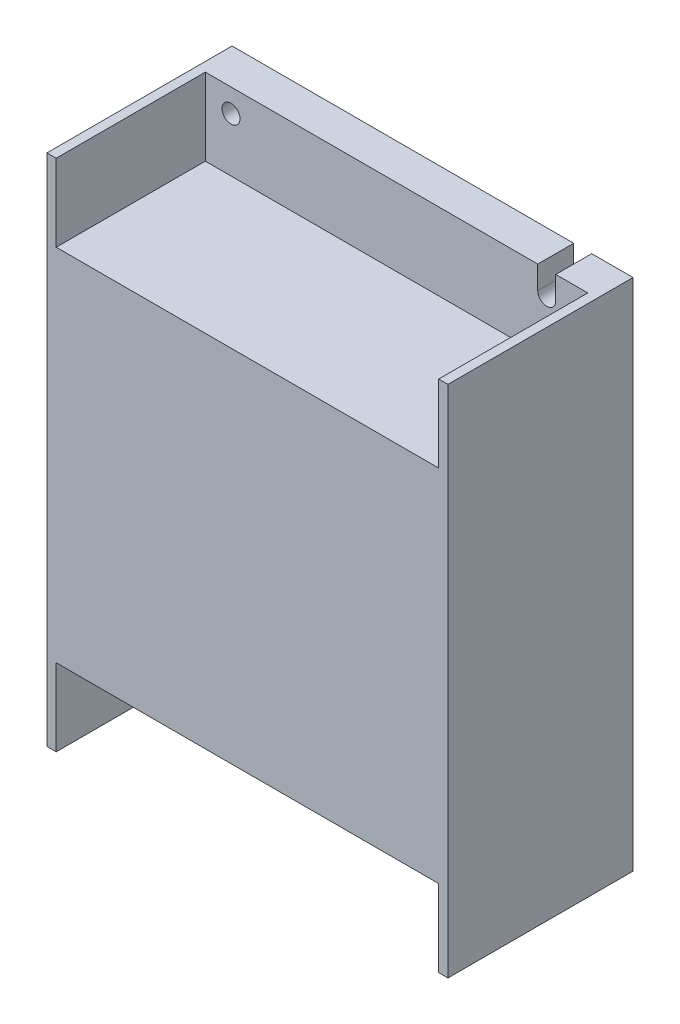
ISO-10303-21;
HEADER;
FILE_DESCRIPTION(('STEP AP214'),'2;1');
FILE_NAME('part.step','',(''),(''),'','','');
FILE_SCHEMA(('AUTOMOTIVE_DESIGN { 1 0 10303 214 1 1 1 1 }'));
ENDSEC;
DATA;
#1=APPLICATION_CONTEXT('core data for automotive mechanical design processes');
#2=APPLICATION_PROTOCOL_DEFINITION('international standard','automotive_design',2000,#1);
#3=PRODUCT_CONTEXT('',#1,'mechanical');
#4=PRODUCT('Part','Part','',(#3));
#5=PRODUCT_RELATED_PRODUCT_CATEGORY('part','',(#4));
#6=PRODUCT_DEFINITION_FORMATION('','',#4);
#7=PRODUCT_DEFINITION_CONTEXT('part definition',#1,'design');
#8=PRODUCT_DEFINITION('design','',#6,#7);
#9=PRODUCT_DEFINITION_SHAPE('','',#8);
#10=(LENGTH_UNIT() NAMED_UNIT(*) SI_UNIT(.MILLI.,.METRE.));
#11=(NAMED_UNIT(*) PLANE_ANGLE_UNIT() SI_UNIT($,.RADIAN.));
#12=(NAMED_UNIT(*) SI_UNIT($,.STERADIAN.) SOLID_ANGLE_UNIT());
#13=UNCERTAINTY_MEASURE_WITH_UNIT(LENGTH_MEASURE(1.E-05),#10,'distance_accuracy_value','');
#14=(GEOMETRIC_REPRESENTATION_CONTEXT(3) GLOBAL_UNCERTAINTY_ASSIGNED_CONTEXT((#13)) GLOBAL_UNIT_ASSIGNED_CONTEXT((#10,
#11,#12)) REPRESENTATION_CONTEXT('',''));
#15=CARTESIAN_POINT('',(0.,0.,0.));
#16=DIRECTION('',(0.,0.,1.));
#17=DIRECTION('',(1.,0.,0.));
#18=AXIS2_PLACEMENT_3D('',#15,#16,#17);
#19=CARTESIAN_POINT('',(-39.,-50.,36.));
#20=DIRECTION('',(0.,1.,0.));
#21=DIRECTION('',(0.,0.,1.));
#22=AXIS2_PLACEMENT_3D('',#19,#20,#21);
#23=PLANE('',#22);
#24=DIRECTION('',(0.,0.,1.));
#25=VECTOR('',#24,1.);
#26=CARTESIAN_POINT('',(-37.2,-50.,-75.8970355152295));
#27=LINE('',#26,#25);
#28=CARTESIAN_POINT('',(-37.2,-50.,7.00000000000001));
#29=VERTEX_POINT('',#28);
#30=CARTESIAN_POINT('',(-37.2,-50.,36.));
#31=VERTEX_POINT('',#30);
#32=EDGE_CURVE('E177',#29,#31,#27,.T.);
#33=ORIENTED_EDGE('',*,*,#32,.T.);
#34=DIRECTION('',(1.,0.,0.));
#35=VECTOR('',#34,1.);
#36=CARTESIAN_POINT('',(-39.,-50.,36.));
#37=LINE('',#36,#35);
#38=CARTESIAN_POINT('',(-39.,-50.,36.));
#39=VERTEX_POINT('',#38);
#40=EDGE_CURVE('E190',#39,#31,#37,.T.);
#41=ORIENTED_EDGE('',*,*,#40,.F.);
#42=DIRECTION('',(0.,0.,-1.));
#43=VECTOR('',#42,1.);
#44=CARTESIAN_POINT('',(-39.,-50.,36.));
#45=LINE('',#44,#43);
#46=CARTESIAN_POINT('',(-39.,-50.,0.));
#47=VERTEX_POINT('',#46);
#48=EDGE_CURVE('E204',#39,#47,#45,.T.);
#49=ORIENTED_EDGE('',*,*,#48,.T.);
#50=DIRECTION('',(1.,0.,0.));
#51=VECTOR('',#50,1.);
#52=CARTESIAN_POINT('',(-39.,-50.,0.));
#53=LINE('',#52,#51);
#54=CARTESIAN_POINT('',(-30.9645076093089,-50.0000000000003,0.));
#55=VERTEX_POINT('',#54);
#56=EDGE_CURVE('E220',#47,#55,#53,.T.);
#57=ORIENTED_EDGE('',*,*,#56,.T.);
#58=DIRECTION('',(0.,0.,-1.));
#59=VECTOR('',#58,1.);
#60=CARTESIAN_POINT('',(-30.9645076093089,-50.0000000000003,10.));
#61=LINE('',#60,#59);
#62=CARTESIAN_POINT('',(-30.9645076093089,-50.,7.00000000000001));
#63=VERTEX_POINT('',#62);
#64=EDGE_CURVE('E325',#63,#55,#61,.T.);
#65=ORIENTED_EDGE('',*,*,#64,.F.);
#66=DIRECTION('',(1.,0.,0.));
#67=VECTOR('',#66,1.);
#68=CARTESIAN_POINT('',(-37.2,-50.,7.00000000000001));
#69=LINE('',#68,#67);
#70=EDGE_CURVE('E192',#29,#63,#69,.T.);
#71=ORIENTED_EDGE('',*,*,#70,.F.);
#72=EDGE_LOOP('',(#33,#41,#49,#57,#65,#71));
#73=FACE_BOUND('',#72,.T.);
#74=ADVANCED_FACE('F37',(#73),#23,.F.);
#75=DIRECTION('',(0.,0.,1.));
#76=VECTOR('',#75,1.);
#77=CARTESIAN_POINT('',(37.2,-50.,-75.8970355152295));
#78=LINE('',#77,#76);
#79=CARTESIAN_POINT('',(37.2,-50.,7.00000000000001));
#80=VERTEX_POINT('',#79);
#81=CARTESIAN_POINT('',(37.2,-50.,36.));
#82=VERTEX_POINT('',#81);
#83=EDGE_CURVE('E193',#80,#82,#78,.T.);
#84=ORIENTED_EDGE('',*,*,#83,.F.);
#85=CARTESIAN_POINT('',(-27.4645076093089,-50.,7.00000000000001));
#86=VERTEX_POINT('',#85);
#87=EDGE_CURVE('E490',#86,#80,#69,.T.);
#88=ORIENTED_EDGE('',*,*,#87,.F.);
#89=DIRECTION('',(0.,0.,-1.));
#90=VECTOR('',#89,1.);
#91=CARTESIAN_POINT('',(-27.4645076093089,-50.0000000000003,10.));
#92=LINE('',#91,#90);
#93=CARTESIAN_POINT('',(-27.4645076093089,-50.0000000000003,0.));
#94=VERTEX_POINT('',#93);
#95=EDGE_CURVE('E317',#86,#94,#92,.T.);
#96=ORIENTED_EDGE('',*,*,#95,.T.);
#97=CARTESIAN_POINT('',(39.,-50.,0.));
#98=VERTEX_POINT('',#97);
#99=EDGE_CURVE('E219',#94,#98,#53,.T.);
#100=ORIENTED_EDGE('',*,*,#99,.T.);
#101=DIRECTION('',(0.,0.,-1.));
#102=VECTOR('',#101,1.);
#103=CARTESIAN_POINT('',(39.,-50.,36.));
#104=LINE('',#103,#102);
#105=CARTESIAN_POINT('',(39.,-50.,36.));
#106=VERTEX_POINT('',#105);
#107=EDGE_CURVE('E200',#106,#98,#104,.T.);
#108=ORIENTED_EDGE('',*,*,#107,.F.);
#109=EDGE_CURVE('E201',#82,#106,#37,.T.);
#110=ORIENTED_EDGE('',*,*,#109,.F.);
#111=EDGE_LOOP('',(#84,#88,#96,#100,#108,#110));
#112=FACE_BOUND('',#111,.T.);
#113=ADVANCED_FACE('F361',(#112),#23,.F.);
#114=CARTESIAN_POINT('',(0.,0.,36.));
#115=DIRECTION('',(0.,0.,1.));
#116=DIRECTION('',(1.,0.,0.));
#117=AXIS2_PLACEMENT_3D('',#114,#115,#116);
#118=PLANE('',#117);
#119=DIRECTION('',(1.,0.,0.));
#120=VECTOR('',#119,1.);
#121=CARTESIAN_POINT('',(-37.2,-35.,36.));
#122=LINE('',#121,#120);
#123=CARTESIAN_POINT('',(-37.2,-35.,36.));
#124=VERTEX_POINT('',#123);
#125=CARTESIAN_POINT('',(37.2,-35.,36.));
#126=VERTEX_POINT('',#125);
#127=EDGE_CURVE('E194',#124,#126,#122,.T.);
#128=ORIENTED_EDGE('',*,*,#127,.T.);
#129=DIRECTION('',(0.,-1.,0.));
#130=VECTOR('',#129,1.);
#131=CARTESIAN_POINT('',(37.2,-50.,36.));
#132=LINE('',#131,#130);
#133=EDGE_CURVE('E185',#126,#82,#132,.T.);
#134=ORIENTED_EDGE('',*,*,#133,.T.);
#135=ORIENTED_EDGE('',*,*,#109,.T.);
#136=DIRECTION('',(0.,1.,0.));
#137=VECTOR('',#136,1.);
#138=CARTESIAN_POINT('',(39.,50.,36.));
#139=LINE('',#138,#137);
#140=CARTESIAN_POINT('',(39.,50.,36.));
#141=VERTEX_POINT('',#140);
#142=EDGE_CURVE('E222',#106,#141,#139,.T.);
#143=ORIENTED_EDGE('',*,*,#142,.T.);
#144=DIRECTION('',(-1.,0.,0.));
#145=VECTOR('',#144,1.);
#146=CARTESIAN_POINT('',(-39.,50.,36.));
#147=LINE('',#146,#145);
#148=CARTESIAN_POINT('',(37.2,50.,36.));
#149=VERTEX_POINT('',#148);
#150=EDGE_CURVE('E289',#141,#149,#147,.T.);
#151=ORIENTED_EDGE('',*,*,#150,.T.);
#152=DIRECTION('',(0.,1.,0.));
#153=VECTOR('',#152,1.);
#154=CARTESIAN_POINT('',(37.2,50.,36.));
#155=LINE('',#154,#153);
#156=CARTESIAN_POINT('',(37.2,35.,36.));
#157=VERTEX_POINT('',#156);
#158=EDGE_CURVE('E276',#157,#149,#155,.T.);
#159=ORIENTED_EDGE('',*,*,#158,.F.);
#160=DIRECTION('',(1.,0.,0.));
#161=VECTOR('',#160,1.);
#162=CARTESIAN_POINT('',(-37.2,35.,36.));
#163=LINE('',#162,#161);
#164=CARTESIAN_POINT('',(-37.2,35.,36.));
#165=VERTEX_POINT('',#164);
#166=EDGE_CURVE('E273',#165,#157,#163,.T.);
#167=ORIENTED_EDGE('',*,*,#166,.F.);
#168=DIRECTION('',(0.,-1.,0.));
#169=VECTOR('',#168,1.);
#170=CARTESIAN_POINT('',(-37.2,50.,36.));
#171=LINE('',#170,#169);
#172=CARTESIAN_POINT('',(-37.2,50.,36.));
#173=VERTEX_POINT('',#172);
#174=EDGE_CURVE('E235',#173,#165,#171,.T.);
#175=ORIENTED_EDGE('',*,*,#174,.F.);
#176=CARTESIAN_POINT('',(-39.,50.,36.));
#177=VERTEX_POINT('',#176);
#178=EDGE_CURVE('E288',#173,#177,#147,.T.);
#179=ORIENTED_EDGE('',*,*,#178,.T.);
#180=DIRECTION('',(0.,-1.,0.));
#181=VECTOR('',#180,1.);
#182=CARTESIAN_POINT('',(-39.,50.,36.));
#183=LINE('',#182,#181);
#184=EDGE_CURVE('E198',#177,#39,#183,.T.);
#185=ORIENTED_EDGE('',*,*,#184,.T.);
#186=ORIENTED_EDGE('',*,*,#40,.T.);
#187=DIRECTION('',(0.,1.,0.));
#188=VECTOR('',#187,1.);
#189=CARTESIAN_POINT('',(-37.2,-50.,36.));
#190=LINE('',#189,#188);
#191=EDGE_CURVE('E174',#31,#124,#190,.T.);
#192=ORIENTED_EDGE('',*,*,#191,.T.);
#193=EDGE_LOOP('',(#128,#134,#135,#143,#151,#159,#167,#175,#179,#185,#186,#192));
#194=FACE_BOUND('',#193,.T.);
#195=ADVANCED_FACE('F196',(#194),#118,.T.);
#196=CARTESIAN_POINT('',(32.1994347289344,-45.4999999999997,10.));
#197=DIRECTION('',(0.,0.,-1.));
#198=DIRECTION('',(-1.,0.,0.));
#199=AXIS2_PLACEMENT_3D('',#196,#197,#198);
#200=CYLINDRICAL_SURFACE('',#199,1.75);
#201=CARTESIAN_POINT('',(32.1994347289344,-45.4999999999997,0.));
#202=DIRECTION('',(0.,0.,-1.));
#203=DIRECTION('',(-1.,0.,0.));
#204=AXIS2_PLACEMENT_3D('',#201,#202,#203);
#205=CIRCLE('',#204,1.75);
#206=CARTESIAN_POINT('',(30.4494347289344,-45.4999999999997,0.));
#207=VERTEX_POINT('',#206);
#208=EDGE_CURVE('E324',#207,#207,#205,.T.);
#209=ORIENTED_EDGE('',*,*,#208,.T.);
#210=EDGE_LOOP('',(#209));
#211=FACE_BOUND('',#210,.T.);
#212=CARTESIAN_POINT('',(32.1994347289344,-45.4999999999997,7.));
#213=DIRECTION('',(0.,0.,1.));
#214=DIRECTION('',(1.,0.,0.));
#215=AXIS2_PLACEMENT_3D('',#212,#213,#214);
#216=CIRCLE('',#215,1.75);
#217=CARTESIAN_POINT('',(33.9494347289344,-45.4999999999997,7.));
#218=VERTEX_POINT('',#217);
#219=EDGE_CURVE('E499',#218,#218,#216,.F.);
#220=ORIENTED_EDGE('',*,*,#219,.F.);
#221=EDGE_LOOP('',(#220));
#222=FACE_BOUND('',#221,.T.);
#223=ADVANCED_FACE('F387',(#211,#222),#200,.F.);
#224=CARTESIAN_POINT('',(-29.2145076093089,-45.5000000000003,10.));
#225=DIRECTION('',(0.,0.,-1.));
#226=DIRECTION('',(-1.,0.,0.));
#227=AXIS2_PLACEMENT_3D('',#224,#225,#226);
#228=CYLINDRICAL_SURFACE('',#227,1.75);
#229=CARTESIAN_POINT('',(-29.2145076093089,-45.5000000000003,7.));
#230=DIRECTION('',(0.,0.,1.));
#231=DIRECTION('',(1.,0.,0.));
#232=AXIS2_PLACEMENT_3D('',#229,#230,#231);
#233=CIRCLE('',#232,1.75);
#234=CARTESIAN_POINT('',(-30.9645076093089,-45.5000000000003,7.));
#235=VERTEX_POINT('',#234);
#236=CARTESIAN_POINT('',(-27.4645076093089,-45.5000000000003,7.));
#237=VERTEX_POINT('',#236);
#238=EDGE_CURVE('E51',#235,#237,#233,.F.);
#239=ORIENTED_EDGE('',*,*,#238,.F.);
#240=DIRECTION('',(0.,0.,-1.));
#241=VECTOR('',#240,1.);
#242=CARTESIAN_POINT('',(-30.9645076093089,-45.5000000000003,10.));
#243=LINE('',#242,#241);
#244=CARTESIAN_POINT('',(-30.9645076093089,-45.5000000000003,0.));
#245=VERTEX_POINT('',#244);
#246=EDGE_CURVE('E322',#235,#245,#243,.T.);
#247=ORIENTED_EDGE('',*,*,#246,.T.);
#248=CARTESIAN_POINT('',(-29.2145076093089,-45.5000000000003,0.));
#249=DIRECTION('',(0.,0.,-1.));
#250=DIRECTION('',(1.,0.,0.));
#251=AXIS2_PLACEMENT_3D('',#248,#249,#250);
#252=CIRCLE('',#251,1.75);
#253=CARTESIAN_POINT('',(-27.4645076093089,-45.5000000000003,0.));
#254=VERTEX_POINT('',#253);
#255=EDGE_CURVE('E312',#245,#254,#252,.T.);
#256=ORIENTED_EDGE('',*,*,#255,.T.);
#257=DIRECTION('',(0.,0.,-1.));
#258=VECTOR('',#257,1.);
#259=CARTESIAN_POINT('',(-27.4645076093089,-45.5000000000003,10.));
#260=LINE('',#259,#258);
#261=EDGE_CURVE('E58',#237,#254,#260,.T.);
#262=ORIENTED_EDGE('',*,*,#261,.F.);
#263=EDGE_LOOP('',(#239,#247,#256,#262));
#264=FACE_BOUND('',#263,.T.);
#265=ADVANCED_FACE('F381',(#264),#228,.F.);
#266=CARTESIAN_POINT('',(-30.9645076093089,-50.0000000000003,10.));
#267=DIRECTION('',(-1.,0.,0.));
#268=DIRECTION('',(0.,0.,1.));
#269=AXIS2_PLACEMENT_3D('',#266,#267,#268);
#270=PLANE('',#269);
#271=DIRECTION('',(0.,1.,0.));
#272=VECTOR('',#271,1.);
#273=CARTESIAN_POINT('',(-30.9645076093089,-50.0000000000003,7.));
#274=LINE('',#273,#272);
#275=EDGE_CURVE('E496',#63,#235,#274,.T.);
#276=ORIENTED_EDGE('',*,*,#275,.F.);
#277=ORIENTED_EDGE('',*,*,#64,.T.);
#278=DIRECTION('',(0.,1.,0.));
#279=VECTOR('',#278,1.);
#280=CARTESIAN_POINT('',(-30.9645076093089,-50.0000000000003,0.));
#281=LINE('',#280,#279);
#282=EDGE_CURVE('E310',#55,#245,#281,.T.);
#283=ORIENTED_EDGE('',*,*,#282,.T.);
#284=ORIENTED_EDGE('',*,*,#246,.F.);
#285=EDGE_LOOP('',(#276,#277,#283,#284));
#286=FACE_BOUND('',#285,.T.);
#287=ADVANCED_FACE('F376',(#286),#270,.F.);
#288=CARTESIAN_POINT('',(-27.4645076093089,-45.5000000000003,10.));
#289=DIRECTION('',(1.,0.,0.));
#290=DIRECTION('',(0.,0.,-1.));
#291=AXIS2_PLACEMENT_3D('',#288,#289,#290);
#292=PLANE('',#291);
#293=DIRECTION('',(0.,-1.,0.));
#294=VECTOR('',#293,1.);
#295=CARTESIAN_POINT('',(-27.4645076093089,-45.5000000000003,7.));
#296=LINE('',#295,#294);
#297=EDGE_CURVE('E12',#237,#86,#296,.T.);
#298=ORIENTED_EDGE('',*,*,#297,.F.);
#299=ORIENTED_EDGE('',*,*,#261,.T.);
#300=DIRECTION('',(0.,-1.,0.));
#301=VECTOR('',#300,1.);
#302=CARTESIAN_POINT('',(-27.4645076093089,-45.5000000000003,0.));
#303=LINE('',#302,#301);
#304=EDGE_CURVE('E315',#254,#94,#303,.T.);
#305=ORIENTED_EDGE('',*,*,#304,.T.);
#306=ORIENTED_EDGE('',*,*,#95,.F.);
#307=EDGE_LOOP('',(#298,#299,#305,#306));
#308=FACE_BOUND('',#307,.T.);
#309=ADVANCED_FACE('F372',(#308),#292,.F.);
#310=CARTESIAN_POINT('',(-39.,50.,36.));
#311=DIRECTION('',(0.,-1.,0.));
#312=DIRECTION('',(0.,0.,-1.));
#313=AXIS2_PLACEMENT_3D('',#310,#311,#312);
#314=PLANE('',#313);
#315=DIRECTION('',(-1.,0.,0.));
#316=VECTOR('',#315,1.);
#317=CARTESIAN_POINT('',(-39.,50.,0.));
#318=LINE('',#317,#316);
#319=CARTESIAN_POINT('',(39.,50.,0.));
#320=VERTEX_POINT('',#319);
#321=CARTESIAN_POINT('',(30.9645076093089,50.,0.));
#322=VERTEX_POINT('',#321);
#323=EDGE_CURVE('E214',#320,#322,#318,.T.);
#324=ORIENTED_EDGE('',*,*,#323,.T.);
#325=DIRECTION('',(0.,0.,-1.));
#326=VECTOR('',#325,1.);
#327=CARTESIAN_POINT('',(30.9645076093089,50.,10.));
#328=LINE('',#327,#326);
#329=CARTESIAN_POINT('',(30.9645076093089,50.,7.));
#330=VERTEX_POINT('',#329);
#331=EDGE_CURVE('E245',#330,#322,#328,.T.);
#332=ORIENTED_EDGE('',*,*,#331,.F.);
#333=DIRECTION('',(1.,0.,0.));
#334=VECTOR('',#333,1.);
#335=CARTESIAN_POINT('',(-37.2,50.,7.00000000000001));
#336=LINE('',#335,#334);
#337=CARTESIAN_POINT('',(37.2,50.,7.00000000000001));
#338=VERTEX_POINT('',#337);
#339=EDGE_CURVE('E254',#330,#338,#336,.T.);
#340=ORIENTED_EDGE('',*,*,#339,.T.);
#341=DIRECTION('',(0.,0.,1.));
#342=VECTOR('',#341,1.);
#343=CARTESIAN_POINT('',(37.2,50.,-75.8970355152295));
#344=LINE('',#343,#342);
#345=EDGE_CURVE('E280',#338,#149,#344,.T.);
#346=ORIENTED_EDGE('',*,*,#345,.T.);
#347=ORIENTED_EDGE('',*,*,#150,.F.);
#348=DIRECTION('',(0.,0.,-1.));
#349=VECTOR('',#348,1.);
#350=CARTESIAN_POINT('',(39.,50.,36.));
#351=LINE('',#350,#349);
#352=EDGE_CURVE('E228',#141,#320,#351,.T.);
#353=ORIENTED_EDGE('',*,*,#352,.T.);
#354=EDGE_LOOP('',(#324,#332,#340,#346,#347,#353));
#355=FACE_BOUND('',#354,.T.);
#356=ADVANCED_FACE('F252',(#355),#314,.F.);
#357=CARTESIAN_POINT('',(39.,50.,36.));
#358=DIRECTION('',(-1.,0.,0.));
#359=DIRECTION('',(0.,-1.,0.));
#360=AXIS2_PLACEMENT_3D('',#357,#358,#359);
#361=PLANE('',#360);
#362=DIRECTION('',(0.,1.,0.));
#363=VECTOR('',#362,1.);
#364=CARTESIAN_POINT('',(39.,50.,0.));
#365=LINE('',#364,#363);
#366=EDGE_CURVE('E209',#98,#320,#365,.T.);
#367=ORIENTED_EDGE('',*,*,#366,.T.);
#368=ORIENTED_EDGE('',*,*,#352,.F.);
#369=ORIENTED_EDGE('',*,*,#142,.F.);
#370=ORIENTED_EDGE('',*,*,#107,.T.);
#371=EDGE_LOOP('',(#367,#368,#369,#370));
#372=FACE_BOUND('',#371,.T.);
#373=ADVANCED_FACE('F39',(#372),#361,.F.);
#374=CARTESIAN_POINT('',(-37.2,50.,7.00000000000001));
#375=VERTEX_POINT('',#374);
#376=CARTESIAN_POINT('',(27.4645076093089,50.,7.00000000000001));
#377=VERTEX_POINT('',#376);
#378=EDGE_CURVE('E263',#375,#377,#336,.T.);
#379=ORIENTED_EDGE('',*,*,#378,.T.);
#380=DIRECTION('',(0.,0.,-1.));
#381=VECTOR('',#380,1.);
#382=CARTESIAN_POINT('',(27.4645076093089,50.,10.));
#383=LINE('',#382,#381);
#384=CARTESIAN_POINT('',(27.4645076093089,50.,0.));
#385=VERTEX_POINT('',#384);
#386=EDGE_CURVE('E256',#377,#385,#383,.T.);
#387=ORIENTED_EDGE('',*,*,#386,.T.);
#388=CARTESIAN_POINT('',(-39.,50.,0.));
#389=VERTEX_POINT('',#388);
#390=EDGE_CURVE('E212',#385,#389,#318,.T.);
#391=ORIENTED_EDGE('',*,*,#390,.T.);
#392=DIRECTION('',(0.,0.,-1.));
#393=VECTOR('',#392,1.);
#394=CARTESIAN_POINT('',(-39.,50.,36.));
#395=LINE('',#394,#393);
#396=EDGE_CURVE('E225',#177,#389,#395,.T.);
#397=ORIENTED_EDGE('',*,*,#396,.F.);
#398=ORIENTED_EDGE('',*,*,#178,.F.);
#399=DIRECTION('',(0.,0.,1.));
#400=VECTOR('',#399,1.);
#401=CARTESIAN_POINT('',(-37.2,50.,-75.8970355152295));
#402=LINE('',#401,#400);
#403=EDGE_CURVE('E267',#375,#173,#402,.T.);
#404=ORIENTED_EDGE('',*,*,#403,.F.);
#405=EDGE_LOOP('',(#379,#387,#391,#397,#398,#404));
#406=FACE_BOUND('',#405,.T.);
#407=ADVANCED_FACE('F298',(#406),#314,.F.);
#408=CARTESIAN_POINT('',(-39.,50.,36.));
#409=DIRECTION('',(1.,0.,0.));
#410=DIRECTION('',(0.,1.,0.));
#411=AXIS2_PLACEMENT_3D('',#408,#409,#410);
#412=PLANE('',#411);
#413=DIRECTION('',(0.,-1.,0.));
#414=VECTOR('',#413,1.);
#415=CARTESIAN_POINT('',(-39.,50.,0.));
#416=LINE('',#415,#414);
#417=EDGE_CURVE('E217',#389,#47,#416,.T.);
#418=ORIENTED_EDGE('',*,*,#417,.T.);
#419=ORIENTED_EDGE('',*,*,#48,.F.);
#420=ORIENTED_EDGE('',*,*,#184,.F.);
#421=ORIENTED_EDGE('',*,*,#396,.T.);
#422=EDGE_LOOP('',(#418,#419,#420,#421));
#423=FACE_BOUND('',#422,.T.);
#424=ADVANCED_FACE('F303',(#423),#412,.F.);
#425=CARTESIAN_POINT('',(0.,0.,0.));
#426=DIRECTION('',(0.,0.,1.));
#427=DIRECTION('',(1.,0.,0.));
#428=AXIS2_PLACEMENT_3D('',#425,#426,#427);
#429=PLANE('',#428);
#430=ORIENTED_EDGE('',*,*,#208,.F.);
#431=EDGE_LOOP('',(#430));
#432=FACE_BOUND('',#431,.T.);
#433=CARTESIAN_POINT('',(-32.199434728934,45.5,0.));
#434=DIRECTION('',(0.,0.,-1.));
#435=DIRECTION('',(-1.,0.,0.));
#436=AXIS2_PLACEMENT_3D('',#433,#434,#435);
#437=CIRCLE('',#436,1.75);
#438=CARTESIAN_POINT('',(-33.949434728934,45.5,0.));
#439=VERTEX_POINT('',#438);
#440=EDGE_CURVE('E236',#439,#439,#437,.T.);
#441=ORIENTED_EDGE('',*,*,#440,.F.);
#442=EDGE_LOOP('',(#441));
#443=FACE_BOUND('',#442,.T.);
#444=ORIENTED_EDGE('',*,*,#255,.F.);
#445=ORIENTED_EDGE('',*,*,#282,.F.);
#446=ORIENTED_EDGE('',*,*,#56,.F.);
#447=ORIENTED_EDGE('',*,*,#417,.F.);
#448=ORIENTED_EDGE('',*,*,#390,.F.);
#449=DIRECTION('',(0.,1.,0.));
#450=VECTOR('',#449,1.);
#451=CARTESIAN_POINT('',(27.4645076093089,45.5,0.));
#452=LINE('',#451,#450);
#453=CARTESIAN_POINT('',(27.4645076093089,45.5,0.));
#454=VERTEX_POINT('',#453);
#455=EDGE_CURVE('E333',#454,#385,#452,.T.);
#456=ORIENTED_EDGE('',*,*,#455,.F.);
#457=CARTESIAN_POINT('',(29.2145076093089,45.5,0.));
#458=DIRECTION('',(0.,0.,-1.));
#459=DIRECTION('',(1.,0.,0.));
#460=AXIS2_PLACEMENT_3D('',#457,#458,#459);
#461=CIRCLE('',#460,1.75);
#462=CARTESIAN_POINT('',(30.9645076093089,45.5,0.));
#463=VERTEX_POINT('',#462);
#464=EDGE_CURVE('E330',#463,#454,#461,.T.);
#465=ORIENTED_EDGE('',*,*,#464,.F.);
#466=DIRECTION('',(0.,-1.,0.));
#467=VECTOR('',#466,1.);
#468=CARTESIAN_POINT('',(30.9645076093089,50.,0.));
#469=LINE('',#468,#467);
#470=EDGE_CURVE('E335',#322,#463,#469,.T.);
#471=ORIENTED_EDGE('',*,*,#470,.F.);
#472=ORIENTED_EDGE('',*,*,#323,.F.);
#473=ORIENTED_EDGE('',*,*,#366,.F.);
#474=ORIENTED_EDGE('',*,*,#99,.F.);
#475=ORIENTED_EDGE('',*,*,#304,.F.);
#476=EDGE_LOOP('',(#444,#445,#446,#447,#448,#456,#465,#471,#472,#473,#474,#475));
#477=FACE_BOUND('',#476,.T.);
#478=ADVANCED_FACE('F308',(#432,#443,#477),#429,.F.);
#479=CARTESIAN_POINT('',(-37.2,50.,-75.8970355152295));
#480=DIRECTION('',(-1.,0.,0.));
#481=DIRECTION('',(0.,-1.,0.));
#482=AXIS2_PLACEMENT_3D('',#479,#480,#481);
#483=PLANE('',#482);
#484=DIRECTION('',(0.,1.,0.));
#485=VECTOR('',#484,1.);
#486=CARTESIAN_POINT('',(-37.2,50.,7.00000000000001));
#487=LINE('',#486,#485);
#488=CARTESIAN_POINT('',(-37.2,35.,7.00000000000001));
#489=VERTEX_POINT('',#488);
#490=EDGE_CURVE('E266',#489,#375,#487,.T.);
#491=ORIENTED_EDGE('',*,*,#490,.T.);
#492=ORIENTED_EDGE('',*,*,#403,.T.);
#493=ORIENTED_EDGE('',*,*,#174,.T.);
#494=DIRECTION('',(0.,0.,1.));
#495=VECTOR('',#494,1.);
#496=CARTESIAN_POINT('',(-37.2,35.,-75.8970355152295));
#497=LINE('',#496,#495);
#498=EDGE_CURVE('E278',#489,#165,#497,.T.);
#499=ORIENTED_EDGE('',*,*,#498,.F.);
#500=EDGE_LOOP('',(#491,#492,#493,#499));
#501=FACE_BOUND('',#500,.T.);
#502=ADVANCED_FACE('F346',(#501),#483,.F.);
#503=CARTESIAN_POINT('',(37.2,50.,-75.8970355152295));
#504=DIRECTION('',(1.,0.,0.));
#505=DIRECTION('',(0.,1.,0.));
#506=AXIS2_PLACEMENT_3D('',#503,#504,#505);
#507=PLANE('',#506);
#508=DIRECTION('',(0.,-1.,0.));
#509=VECTOR('',#508,1.);
#510=CARTESIAN_POINT('',(37.2,50.,7.00000000000001));
#511=LINE('',#510,#509);
#512=CARTESIAN_POINT('',(37.2,35.,7.00000000000001));
#513=VERTEX_POINT('',#512);
#514=EDGE_CURVE('E261',#338,#513,#511,.T.);
#515=ORIENTED_EDGE('',*,*,#514,.T.);
#516=DIRECTION('',(0.,0.,1.));
#517=VECTOR('',#516,1.);
#518=CARTESIAN_POINT('',(37.2,35.,-75.8970355152295));
#519=LINE('',#518,#517);
#520=EDGE_CURVE('E282',#513,#157,#519,.T.);
#521=ORIENTED_EDGE('',*,*,#520,.T.);
#522=ORIENTED_EDGE('',*,*,#158,.T.);
#523=ORIENTED_EDGE('',*,*,#345,.F.);
#524=EDGE_LOOP('',(#515,#521,#522,#523));
#525=FACE_BOUND('',#524,.T.);
#526=ADVANCED_FACE('F353',(#525),#507,.F.);
#527=CARTESIAN_POINT('',(-37.2,35.,-75.8970355152295));
#528=DIRECTION('',(0.,-1.,0.));
#529=DIRECTION('',(0.,0.,-1.));
#530=AXIS2_PLACEMENT_3D('',#527,#528,#529);
#531=PLANE('',#530);
#532=DIRECTION('',(-1.,0.,0.));
#533=VECTOR('',#532,1.);
#534=CARTESIAN_POINT('',(-37.2,35.,7.00000000000001));
#535=LINE('',#534,#533);
#536=EDGE_CURVE('E213',#513,#489,#535,.T.);
#537=ORIENTED_EDGE('',*,*,#536,.T.);
#538=ORIENTED_EDGE('',*,*,#498,.T.);
#539=ORIENTED_EDGE('',*,*,#166,.T.);
#540=ORIENTED_EDGE('',*,*,#520,.F.);
#541=EDGE_LOOP('',(#537,#538,#539,#540));
#542=FACE_BOUND('',#541,.T.);
#543=ADVANCED_FACE('F408',(#542),#531,.F.);
#544=CARTESIAN_POINT('',(0.,0.,7.));
#545=DIRECTION('',(0.,0.,1.));
#546=DIRECTION('',(1.,0.,0.));
#547=AXIS2_PLACEMENT_3D('',#544,#545,#546);
#548=PLANE('',#547);
#549=DIRECTION('',(0.,1.,0.));
#550=VECTOR('',#549,1.);
#551=CARTESIAN_POINT('',(30.9645076093089,0.,7.));
#552=LINE('',#551,#550);
#553=CARTESIAN_POINT('',(30.9645076093089,45.5,7.));
#554=VERTEX_POINT('',#553);
#555=EDGE_CURVE('E45',#554,#330,#552,.T.);
#556=ORIENTED_EDGE('',*,*,#555,.F.);
#557=CARTESIAN_POINT('',(29.2145076093089,45.5,7.));
#558=DIRECTION('',(0.,0.,1.));
#559=DIRECTION('',(1.,0.,0.));
#560=AXIS2_PLACEMENT_3D('',#557,#558,#559);
#561=CIRCLE('',#560,1.75);
#562=CARTESIAN_POINT('',(27.4645076093089,45.5,7.));
#563=VERTEX_POINT('',#562);
#564=EDGE_CURVE('E238',#563,#554,#561,.T.);
#565=ORIENTED_EDGE('',*,*,#564,.F.);
#566=DIRECTION('',(0.,-1.,0.));
#567=VECTOR('',#566,1.);
#568=CARTESIAN_POINT('',(27.4645076093089,0.,7.));
#569=LINE('',#568,#567);
#570=EDGE_CURVE('E231',#377,#563,#569,.T.);
#571=ORIENTED_EDGE('',*,*,#570,.F.);
#572=ORIENTED_EDGE('',*,*,#378,.F.);
#573=ORIENTED_EDGE('',*,*,#490,.F.);
#574=ORIENTED_EDGE('',*,*,#536,.F.);
#575=ORIENTED_EDGE('',*,*,#514,.F.);
#576=ORIENTED_EDGE('',*,*,#339,.F.);
#577=EDGE_LOOP('',(#556,#565,#571,#572,#573,#574,#575,#576));
#578=FACE_BOUND('',#577,.T.);
#579=CARTESIAN_POINT('',(-32.199434728934,45.5,7.));
#580=DIRECTION('',(0.,0.,1.));
#581=DIRECTION('',(1.,0.,0.));
#582=AXIS2_PLACEMENT_3D('',#579,#580,#581);
#583=CIRCLE('',#582,1.75);
#584=CARTESIAN_POINT('',(-30.449434728934,45.5,7.));
#585=VERTEX_POINT('',#584);
#586=EDGE_CURVE('E232',#585,#585,#583,.T.);
#587=ORIENTED_EDGE('',*,*,#586,.F.);
#588=EDGE_LOOP('',(#587));
#589=FACE_BOUND('',#588,.T.);
#590=ADVANCED_FACE('F258',(#578,#589),#548,.T.);
#591=CARTESIAN_POINT('',(-32.199434728934,45.5,10.));
#592=DIRECTION('',(0.,0.,-1.));
#593=DIRECTION('',(-1.,0.,0.));
#594=AXIS2_PLACEMENT_3D('',#591,#592,#593);
#595=CYLINDRICAL_SURFACE('',#594,1.75);
#596=ORIENTED_EDGE('',*,*,#586,.T.);
#597=EDGE_LOOP('',(#596));
#598=FACE_BOUND('',#597,.T.);
#599=ORIENTED_EDGE('',*,*,#440,.T.);
#600=EDGE_LOOP('',(#599));
#601=FACE_BOUND('',#600,.T.);
#602=ADVANCED_FACE('F343',(#598,#601),#595,.F.);
#603=CARTESIAN_POINT('',(29.2145076093089,45.5,10.));
#604=DIRECTION('',(0.,0.,-1.));
#605=DIRECTION('',(-1.,0.,0.));
#606=AXIS2_PLACEMENT_3D('',#603,#604,#605);
#607=CYLINDRICAL_SURFACE('',#606,1.75);
#608=ORIENTED_EDGE('',*,*,#564,.T.);
#609=DIRECTION('',(0.,0.,-1.));
#610=VECTOR('',#609,1.);
#611=CARTESIAN_POINT('',(30.9645076093089,45.5,10.));
#612=LINE('',#611,#610);
#613=EDGE_CURVE('E247',#554,#463,#612,.T.);
#614=ORIENTED_EDGE('',*,*,#613,.T.);
#615=ORIENTED_EDGE('',*,*,#464,.T.);
#616=DIRECTION('',(0.,0.,-1.));
#617=VECTOR('',#616,1.);
#618=CARTESIAN_POINT('',(27.4645076093089,45.5,10.));
#619=LINE('',#618,#617);
#620=EDGE_CURVE('E337',#563,#454,#619,.T.);
#621=ORIENTED_EDGE('',*,*,#620,.F.);
#622=EDGE_LOOP('',(#608,#614,#615,#621));
#623=FACE_BOUND('',#622,.T.);
#624=ADVANCED_FACE('F395',(#623),#607,.F.);
#625=CARTESIAN_POINT('',(30.9645076093089,50.,10.));
#626=DIRECTION('',(1.,0.,0.));
#627=DIRECTION('',(0.,0.,-1.));
#628=AXIS2_PLACEMENT_3D('',#625,#626,#627);
#629=PLANE('',#628);
#630=ORIENTED_EDGE('',*,*,#555,.T.);
#631=ORIENTED_EDGE('',*,*,#331,.T.);
#632=ORIENTED_EDGE('',*,*,#470,.T.);
#633=ORIENTED_EDGE('',*,*,#613,.F.);
#634=EDGE_LOOP('',(#630,#631,#632,#633));
#635=FACE_BOUND('',#634,.T.);
#636=ADVANCED_FACE('F243',(#635),#629,.F.);
#637=CARTESIAN_POINT('',(27.4645076093089,45.5,10.));
#638=DIRECTION('',(-1.,0.,0.));
#639=DIRECTION('',(0.,0.,1.));
#640=AXIS2_PLACEMENT_3D('',#637,#638,#639);
#641=PLANE('',#640);
#642=ORIENTED_EDGE('',*,*,#570,.T.);
#643=ORIENTED_EDGE('',*,*,#620,.T.);
#644=ORIENTED_EDGE('',*,*,#455,.T.);
#645=ORIENTED_EDGE('',*,*,#386,.F.);
#646=EDGE_LOOP('',(#642,#643,#644,#645));
#647=FACE_BOUND('',#646,.T.);
#648=ADVANCED_FACE('F394',(#647),#641,.F.);
#649=CARTESIAN_POINT('',(0.,0.,7.));
#650=DIRECTION('',(0.,0.,1.));
#651=DIRECTION('',(1.,0.,0.));
#652=AXIS2_PLACEMENT_3D('',#649,#650,#651);
#653=PLANE('',#652);
#654=ORIENTED_EDGE('',*,*,#275,.T.);
#655=ORIENTED_EDGE('',*,*,#238,.T.);
#656=ORIENTED_EDGE('',*,*,#297,.T.);
#657=ORIENTED_EDGE('',*,*,#87,.T.);
#658=DIRECTION('',(0.,1.,0.));
#659=VECTOR('',#658,1.);
#660=CARTESIAN_POINT('',(37.2,-50.,7.00000000000001));
#661=LINE('',#660,#659);
#662=CARTESIAN_POINT('',(37.2,-35.,7.00000000000001));
#663=VERTEX_POINT('',#662);
#664=EDGE_CURVE('E494',#80,#663,#661,.T.);
#665=ORIENTED_EDGE('',*,*,#664,.T.);
#666=DIRECTION('',(-1.,0.,0.));
#667=VECTOR('',#666,1.);
#668=CARTESIAN_POINT('',(-37.2,-35.,7.00000000000001));
#669=LINE('',#668,#667);
#670=CARTESIAN_POINT('',(-37.2,-35.,7.00000000000001));
#671=VERTEX_POINT('',#670);
#672=EDGE_CURVE('E480',#663,#671,#669,.T.);
#673=ORIENTED_EDGE('',*,*,#672,.T.);
#674=DIRECTION('',(0.,-1.,0.));
#675=VECTOR('',#674,1.);
#676=CARTESIAN_POINT('',(-37.2,-50.,7.00000000000001));
#677=LINE('',#676,#675);
#678=EDGE_CURVE('E497',#671,#29,#677,.T.);
#679=ORIENTED_EDGE('',*,*,#678,.T.);
#680=ORIENTED_EDGE('',*,*,#70,.T.);
#681=EDGE_LOOP('',(#654,#655,#656,#657,#665,#673,#679,#680));
#682=FACE_BOUND('',#681,.T.);
#683=ORIENTED_EDGE('',*,*,#219,.T.);
#684=EDGE_LOOP('',(#683));
#685=FACE_BOUND('',#684,.T.);
#686=ADVANCED_FACE('F398',(#682,#685),#653,.T.);
#687=CARTESIAN_POINT('',(37.2,-50.,-75.8970355152295));
#688=DIRECTION('',(-1.,0.,0.));
#689=DIRECTION('',(0.,-1.,0.));
#690=AXIS2_PLACEMENT_3D('',#687,#688,#689);
#691=PLANE('',#690);
#692=ORIENTED_EDGE('',*,*,#83,.T.);
#693=ORIENTED_EDGE('',*,*,#133,.F.);
#694=DIRECTION('',(0.,0.,1.));
#695=VECTOR('',#694,1.);
#696=CARTESIAN_POINT('',(37.2,-35.,-75.8970355152295));
#697=LINE('',#696,#695);
#698=EDGE_CURVE('E477',#663,#126,#697,.T.);
#699=ORIENTED_EDGE('',*,*,#698,.F.);
#700=ORIENTED_EDGE('',*,*,#664,.F.);
#701=EDGE_LOOP('',(#692,#693,#699,#700));
#702=FACE_BOUND('',#701,.T.);
#703=ADVANCED_FACE('F445',(#702),#691,.T.);
#704=CARTESIAN_POINT('',(-37.2,-35.,-75.8970355152295));
#705=DIRECTION('',(0.,-1.,0.));
#706=DIRECTION('',(0.,0.,-1.));
#707=AXIS2_PLACEMENT_3D('',#704,#705,#706);
#708=PLANE('',#707);
#709=ORIENTED_EDGE('',*,*,#698,.T.);
#710=ORIENTED_EDGE('',*,*,#127,.F.);
#711=DIRECTION('',(0.,0.,1.));
#712=VECTOR('',#711,1.);
#713=CARTESIAN_POINT('',(-37.2,-35.,-75.8970355152295));
#714=LINE('',#713,#712);
#715=EDGE_CURVE('E180',#671,#124,#714,.T.);
#716=ORIENTED_EDGE('',*,*,#715,.F.);
#717=ORIENTED_EDGE('',*,*,#672,.F.);
#718=EDGE_LOOP('',(#709,#710,#716,#717));
#719=FACE_BOUND('',#718,.T.);
#720=ADVANCED_FACE('F455',(#719),#708,.T.);
#721=CARTESIAN_POINT('',(-37.2,-50.,-75.8970355152295));
#722=DIRECTION('',(1.,0.,0.));
#723=DIRECTION('',(0.,1.,0.));
#724=AXIS2_PLACEMENT_3D('',#721,#722,#723);
#725=PLANE('',#724);
#726=ORIENTED_EDGE('',*,*,#715,.T.);
#727=ORIENTED_EDGE('',*,*,#191,.F.);
#728=ORIENTED_EDGE('',*,*,#32,.F.);
#729=ORIENTED_EDGE('',*,*,#678,.F.);
#730=EDGE_LOOP('',(#726,#727,#728,#729));
#731=FACE_BOUND('',#730,.T.);
#732=ADVANCED_FACE('F176',(#731),#725,.T.);
#733=CLOSED_SHELL('',(#74,#113,#195,#223,#265,#287,#309,#356,#373,#407,#424,#478,#502,#526,#543,
#590,#602,#624,#636,#648,#686,#703,#720,#732));
#734=MANIFOLD_SOLID_BREP('B2',#733);
#735=ADVANCED_BREP_SHAPE_REPRESENTATION('',(#18,#734),#14);
#736=SHAPE_DEFINITION_REPRESENTATION(#9,#735);
ENDSEC;
END-ISO-10303-21;
